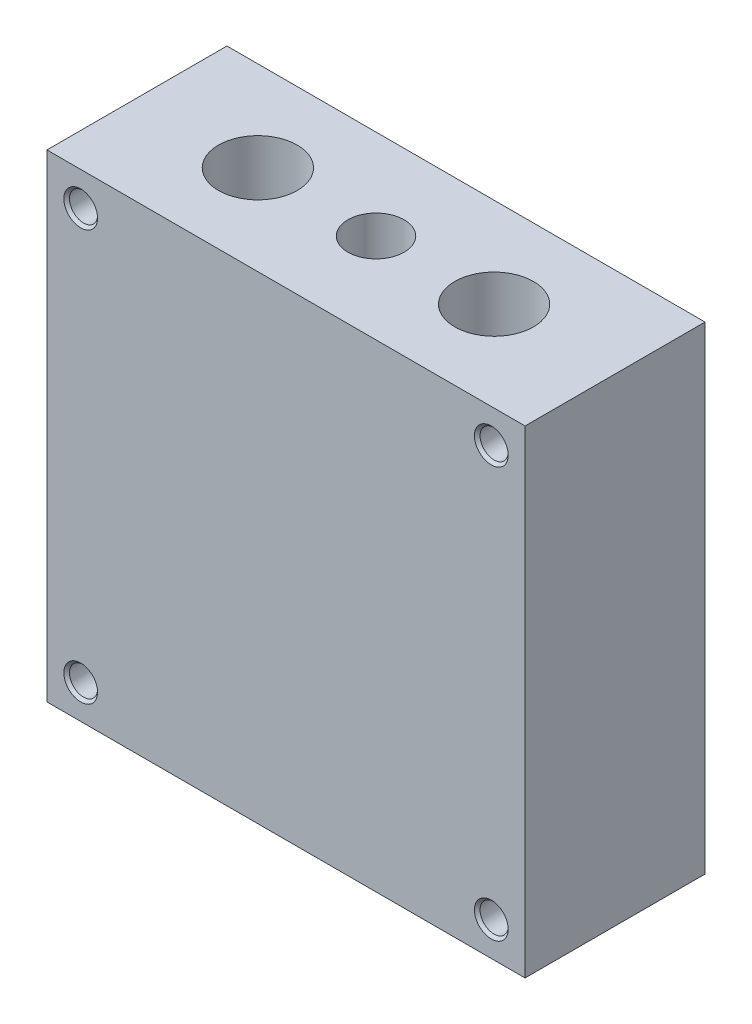
ISO-10303-21;
HEADER;
FILE_DESCRIPTION(('STEP AP214'),'2;1');
FILE_NAME('part.step','',(''),(''),'','','');
FILE_SCHEMA(('AUTOMOTIVE_DESIGN { 1 0 10303 214 1 1 1 1 }'));
ENDSEC;
DATA;
#1=APPLICATION_CONTEXT('core data for automotive mechanical design processes');
#2=APPLICATION_PROTOCOL_DEFINITION('international standard','automotive_design',2000,#1);
#3=PRODUCT_CONTEXT('',#1,'mechanical');
#4=PRODUCT('Part','Part','',(#3));
#5=PRODUCT_RELATED_PRODUCT_CATEGORY('part','',(#4));
#6=PRODUCT_DEFINITION_FORMATION('','',#4);
#7=PRODUCT_DEFINITION_CONTEXT('part definition',#1,'design');
#8=PRODUCT_DEFINITION('design','',#6,#7);
#9=PRODUCT_DEFINITION_SHAPE('','',#8);
#10=(LENGTH_UNIT() NAMED_UNIT(*) SI_UNIT(.MILLI.,.METRE.));
#11=(NAMED_UNIT(*) PLANE_ANGLE_UNIT() SI_UNIT($,.RADIAN.));
#12=(NAMED_UNIT(*) SI_UNIT($,.STERADIAN.) SOLID_ANGLE_UNIT());
#13=UNCERTAINTY_MEASURE_WITH_UNIT(LENGTH_MEASURE(1.E-05),#10,'distance_accuracy_value','');
#14=(GEOMETRIC_REPRESENTATION_CONTEXT(3) GLOBAL_UNCERTAINTY_ASSIGNED_CONTEXT((#13)) GLOBAL_UNIT_ASSIGNED_CONTEXT((#10,
#11,#12)) REPRESENTATION_CONTEXT('',''));
#15=CARTESIAN_POINT('',(0.,0.,0.));
#16=DIRECTION('',(0.,0.,1.));
#17=DIRECTION('',(1.,0.,0.));
#18=AXIS2_PLACEMENT_3D('',#15,#16,#17);
#19=CARTESIAN_POINT('',(21.,197.5,18.));
#20=DIRECTION('',(0.,-1.,0.));
#21=DIRECTION('',(0.,0.,-1.));
#22=AXIS2_PLACEMENT_3D('',#19,#20,#21);
#23=CYLINDRICAL_SURFACE('',#22,7.0001);
#24=CARTESIAN_POINT('',(21.,223.,18.));
#25=DIRECTION('',(0.,-1.,0.));
#26=DIRECTION('',(0.,0.,-1.));
#27=AXIS2_PLACEMENT_3D('',#24,#25,#26);
#28=CIRCLE('',#27,7.0001);
#29=CARTESIAN_POINT('',(21.,223.,10.9999));
#30=VERTEX_POINT('',#29);
#31=EDGE_CURVE('E23',#30,#30,#28,.F.);
#32=ORIENTED_EDGE('',*,*,#31,.T.);
#33=EDGE_LOOP('',(#32));
#34=FACE_BOUND('',#33,.T.);
#35=CARTESIAN_POINT('',(21.,172.,18.));
#36=DIRECTION('',(0.,-1.,0.));
#37=DIRECTION('',(0.,0.,-1.));
#38=AXIS2_PLACEMENT_3D('',#35,#36,#37);
#39=CIRCLE('',#38,7.0001);
#40=CARTESIAN_POINT('',(21.,172.,10.9999));
#41=VERTEX_POINT('',#40);
#42=EDGE_CURVE('E559',#41,#41,#39,.T.);
#43=ORIENTED_EDGE('',*,*,#42,.T.);
#44=EDGE_LOOP('',(#43));
#45=FACE_BOUND('',#44,.T.);
#46=ADVANCED_FACE('F19',(#34,#45),#23,.F.);
#47=CARTESIAN_POINT('',(-21.,197.5,18.));
#48=DIRECTION('',(0.,-1.,0.));
#49=DIRECTION('',(0.,0.,-1.));
#50=AXIS2_PLACEMENT_3D('',#47,#48,#49);
#51=CYLINDRICAL_SURFACE('',#50,7.0001);
#52=CARTESIAN_POINT('',(-21.,223.,18.));
#53=DIRECTION('',(0.,-1.,0.));
#54=DIRECTION('',(0.,0.,-1.));
#55=AXIS2_PLACEMENT_3D('',#52,#53,#54);
#56=CIRCLE('',#55,7.0001);
#57=CARTESIAN_POINT('',(-21.,223.,10.9999));
#58=VERTEX_POINT('',#57);
#59=EDGE_CURVE('E553',#58,#58,#56,.F.);
#60=ORIENTED_EDGE('',*,*,#59,.T.);
#61=EDGE_LOOP('',(#60));
#62=FACE_BOUND('',#61,.T.);
#63=CARTESIAN_POINT('',(-21.,172.,18.));
#64=DIRECTION('',(0.,-1.,0.));
#65=DIRECTION('',(0.,0.,-1.));
#66=AXIS2_PLACEMENT_3D('',#63,#64,#65);
#67=CIRCLE('',#66,7.0001);
#68=CARTESIAN_POINT('',(-21.,172.,10.9999));
#69=VERTEX_POINT('',#68);
#70=EDGE_CURVE('E556',#69,#69,#67,.T.);
#71=ORIENTED_EDGE('',*,*,#70,.T.);
#72=EDGE_LOOP('',(#71));
#73=FACE_BOUND('',#72,.T.);
#74=ADVANCED_FACE('F541',(#62,#73),#51,.F.);
#75=CARTESIAN_POINT('',(21.,223.,18.));
#76=DIRECTION('',(0.,-1.,0.));
#77=DIRECTION('',(0.,0.,-1.));
#78=AXIS2_PLACEMENT_3D('',#75,#76,#77);
#79=PLANE('',#78);
#80=CARTESIAN_POINT('',(21.,223.,18.));
#81=DIRECTION('',(0.,-1.,0.));
#82=DIRECTION('',(0.,0.,-1.));
#83=AXIS2_PLACEMENT_3D('',#80,#81,#82);
#84=CIRCLE('',#83,7.8);
#85=CARTESIAN_POINT('',(21.,223.,10.2));
#86=VERTEX_POINT('',#85);
#87=EDGE_CURVE('E246',#86,#86,#84,.F.);
#88=ORIENTED_EDGE('',*,*,#87,.T.);
#89=EDGE_LOOP('',(#88));
#90=FACE_BOUND('',#89,.T.);
#91=ORIENTED_EDGE('',*,*,#31,.F.);
#92=EDGE_LOOP('',(#91));
#93=FACE_BOUND('',#92,.T.);
#94=ADVANCED_FACE('F538',(#90,#93),#79,.F.);
#95=CARTESIAN_POINT('',(-21.,223.,18.));
#96=DIRECTION('',(0.,-1.,0.));
#97=DIRECTION('',(0.,0.,-1.));
#98=AXIS2_PLACEMENT_3D('',#95,#96,#97);
#99=PLANE('',#98);
#100=CARTESIAN_POINT('',(-21.,223.,18.));
#101=DIRECTION('',(0.,-1.,0.));
#102=DIRECTION('',(0.,0.,-1.));
#103=AXIS2_PLACEMENT_3D('',#100,#101,#102);
#104=CIRCLE('',#103,7.8);
#105=CARTESIAN_POINT('',(-21.,223.,10.2));
#106=VERTEX_POINT('',#105);
#107=EDGE_CURVE('E239',#106,#106,#104,.F.);
#108=ORIENTED_EDGE('',*,*,#107,.T.);
#109=EDGE_LOOP('',(#108));
#110=FACE_BOUND('',#109,.T.);
#111=ORIENTED_EDGE('',*,*,#59,.F.);
#112=EDGE_LOOP('',(#111));
#113=FACE_BOUND('',#112,.T.);
#114=ADVANCED_FACE('F532',(#110,#113),#99,.F.);
#115=CARTESIAN_POINT('',(21.,172.,18.));
#116=DIRECTION('',(0.,1.,0.));
#117=DIRECTION('',(0.,0.,1.));
#118=AXIS2_PLACEMENT_3D('',#115,#116,#117);
#119=PLANE('',#118);
#120=CARTESIAN_POINT('',(21.,172.,18.));
#121=DIRECTION('',(0.,-1.,0.));
#122=DIRECTION('',(0.,0.,-1.));
#123=AXIS2_PLACEMENT_3D('',#120,#121,#122);
#124=CIRCLE('',#123,7.8);
#125=CARTESIAN_POINT('',(21.,172.,10.2));
#126=VERTEX_POINT('',#125);
#127=EDGE_CURVE('E233',#126,#126,#124,.T.);
#128=ORIENTED_EDGE('',*,*,#127,.T.);
#129=EDGE_LOOP('',(#128));
#130=FACE_BOUND('',#129,.T.);
#131=ORIENTED_EDGE('',*,*,#42,.F.);
#132=EDGE_LOOP('',(#131));
#133=FACE_BOUND('',#132,.T.);
#134=ADVANCED_FACE('F528',(#130,#133),#119,.F.);
#135=CARTESIAN_POINT('',(-21.,172.,18.));
#136=DIRECTION('',(0.,1.,0.));
#137=DIRECTION('',(0.,0.,1.));
#138=AXIS2_PLACEMENT_3D('',#135,#136,#137);
#139=PLANE('',#138);
#140=CARTESIAN_POINT('',(-21.,172.,18.));
#141=DIRECTION('',(0.,-1.,0.));
#142=DIRECTION('',(0.,0.,-1.));
#143=AXIS2_PLACEMENT_3D('',#140,#141,#142);
#144=CIRCLE('',#143,7.8);
#145=CARTESIAN_POINT('',(-21.,172.,10.2));
#146=VERTEX_POINT('',#145);
#147=EDGE_CURVE('E226',#146,#146,#144,.T.);
#148=ORIENTED_EDGE('',*,*,#147,.T.);
#149=EDGE_LOOP('',(#148));
#150=FACE_BOUND('',#149,.T.);
#151=ORIENTED_EDGE('',*,*,#70,.F.);
#152=EDGE_LOOP('',(#151));
#153=FACE_BOUND('',#152,.T.);
#154=ADVANCED_FACE('F525',(#150,#153),#139,.F.);
#155=CARTESIAN_POINT('',(36.5,234.,13.));
#156=DIRECTION('',(0.,0.,1.));
#157=DIRECTION('',(1.,0.,0.));
#158=AXIS2_PLACEMENT_3D('',#155,#156,#157);
#159=CYLINDRICAL_SURFACE('',#158,3.15);
#160=CARTESIAN_POINT('',(36.5,234.,8.));
#161=DIRECTION('',(0.,0.,1.));
#162=DIRECTION('',(1.,0.,0.));
#163=AXIS2_PLACEMENT_3D('',#160,#161,#162);
#164=CIRCLE('',#163,3.15);
#165=CARTESIAN_POINT('',(39.65,234.,8.));
#166=VERTEX_POINT('',#165);
#167=EDGE_CURVE('E232',#166,#166,#164,.F.);
#168=ORIENTED_EDGE('',*,*,#167,.T.);
#169=EDGE_LOOP('',(#168));
#170=FACE_BOUND('',#169,.T.);
#171=CARTESIAN_POINT('',(36.5,234.,18.));
#172=DIRECTION('',(0.,0.,1.));
#173=DIRECTION('',(1.,0.,0.));
#174=AXIS2_PLACEMENT_3D('',#171,#172,#173);
#175=CIRCLE('',#174,3.15);
#176=CARTESIAN_POINT('',(39.65,234.,18.));
#177=VERTEX_POINT('',#176);
#178=EDGE_CURVE('E256',#177,#177,#175,.T.);
#179=ORIENTED_EDGE('',*,*,#178,.T.);
#180=EDGE_LOOP('',(#179));
#181=FACE_BOUND('',#180,.T.);
#182=ADVANCED_FACE('F307',(#170,#181),#159,.F.);
#183=CARTESIAN_POINT('',(36.5,161.,13.));
#184=DIRECTION('',(0.,0.,1.));
#185=DIRECTION('',(1.,0.,0.));
#186=AXIS2_PLACEMENT_3D('',#183,#184,#185);
#187=CYLINDRICAL_SURFACE('',#186,3.15);
#188=CARTESIAN_POINT('',(36.5,161.,8.));
#189=DIRECTION('',(0.,0.,1.));
#190=DIRECTION('',(1.,0.,0.));
#191=AXIS2_PLACEMENT_3D('',#188,#189,#190);
#192=CIRCLE('',#191,3.15);
#193=CARTESIAN_POINT('',(39.65,161.,8.));
#194=VERTEX_POINT('',#193);
#195=EDGE_CURVE('E298',#194,#194,#192,.F.);
#196=ORIENTED_EDGE('',*,*,#195,.T.);
#197=EDGE_LOOP('',(#196));
#198=FACE_BOUND('',#197,.T.);
#199=CARTESIAN_POINT('',(36.5,161.,18.));
#200=DIRECTION('',(0.,0.,1.));
#201=DIRECTION('',(1.,0.,0.));
#202=AXIS2_PLACEMENT_3D('',#199,#200,#201);
#203=CIRCLE('',#202,3.15);
#204=CARTESIAN_POINT('',(39.65,161.,18.));
#205=VERTEX_POINT('',#204);
#206=EDGE_CURVE('E252',#205,#205,#203,.T.);
#207=ORIENTED_EDGE('',*,*,#206,.T.);
#208=EDGE_LOOP('',(#207));
#209=FACE_BOUND('',#208,.T.);
#210=ADVANCED_FACE('F516',(#198,#209),#187,.F.);
#211=CARTESIAN_POINT('',(-36.5,234.,13.));
#212=DIRECTION('',(0.,0.,1.));
#213=DIRECTION('',(1.,0.,0.));
#214=AXIS2_PLACEMENT_3D('',#211,#212,#213);
#215=CYLINDRICAL_SURFACE('',#214,3.15);
#216=CARTESIAN_POINT('',(-36.5,234.,8.));
#217=DIRECTION('',(0.,0.,1.));
#218=DIRECTION('',(1.,0.,0.));
#219=AXIS2_PLACEMENT_3D('',#216,#217,#218);
#220=CIRCLE('',#219,3.15);
#221=CARTESIAN_POINT('',(-33.35,234.,8.));
#222=VERTEX_POINT('',#221);
#223=EDGE_CURVE('E295',#222,#222,#220,.F.);
#224=ORIENTED_EDGE('',*,*,#223,.T.);
#225=EDGE_LOOP('',(#224));
#226=FACE_BOUND('',#225,.T.);
#227=CARTESIAN_POINT('',(-36.5,234.,18.));
#228=DIRECTION('',(0.,0.,1.));
#229=DIRECTION('',(1.,0.,0.));
#230=AXIS2_PLACEMENT_3D('',#227,#228,#229);
#231=CIRCLE('',#230,3.15);
#232=CARTESIAN_POINT('',(-33.35,234.,18.));
#233=VERTEX_POINT('',#232);
#234=EDGE_CURVE('E247',#233,#233,#231,.T.);
#235=ORIENTED_EDGE('',*,*,#234,.T.);
#236=EDGE_LOOP('',(#235));
#237=FACE_BOUND('',#236,.T.);
#238=ADVANCED_FACE('F511',(#226,#237),#215,.F.);
#239=CARTESIAN_POINT('',(-36.5,161.,13.));
#240=DIRECTION('',(0.,0.,1.));
#241=DIRECTION('',(1.,0.,0.));
#242=AXIS2_PLACEMENT_3D('',#239,#240,#241);
#243=CYLINDRICAL_SURFACE('',#242,3.15);
#244=CARTESIAN_POINT('',(-36.5,161.,8.));
#245=DIRECTION('',(0.,0.,1.));
#246=DIRECTION('',(1.,0.,0.));
#247=AXIS2_PLACEMENT_3D('',#244,#245,#246);
#248=CIRCLE('',#247,3.15);
#249=CARTESIAN_POINT('',(-33.35,161.,8.));
#250=VERTEX_POINT('',#249);
#251=EDGE_CURVE('E291',#250,#250,#248,.F.);
#252=ORIENTED_EDGE('',*,*,#251,.T.);
#253=EDGE_LOOP('',(#252));
#254=FACE_BOUND('',#253,.T.);
#255=CARTESIAN_POINT('',(-36.5,161.,18.));
#256=DIRECTION('',(0.,0.,1.));
#257=DIRECTION('',(1.,0.,0.));
#258=AXIS2_PLACEMENT_3D('',#255,#256,#257);
#259=CIRCLE('',#258,3.15);
#260=CARTESIAN_POINT('',(-33.35,161.,18.));
#261=VERTEX_POINT('',#260);
#262=EDGE_CURVE('E242',#261,#261,#259,.T.);
#263=ORIENTED_EDGE('',*,*,#262,.T.);
#264=EDGE_LOOP('',(#263));
#265=FACE_BOUND('',#264,.T.);
#266=ADVANCED_FACE('F515',(#254,#265),#243,.F.);
#267=CARTESIAN_POINT('',(38.075,234.,18.));
#268=DIRECTION('',(0.,0.,1.));
#269=DIRECTION('',(1.,0.,0.));
#270=AXIS2_PLACEMENT_3D('',#267,#268,#269);
#271=PLANE('',#270);
#272=ORIENTED_EDGE('',*,*,#178,.F.);
#273=EDGE_LOOP('',(#272));
#274=FACE_BOUND('',#273,.T.);
#275=CARTESIAN_POINT('',(36.5,234.,18.0000000000291));
#276=DIRECTION('',(0.,0.,-1.));
#277=DIRECTION('',(-1.,0.,0.));
#278=AXIS2_PLACEMENT_3D('',#275,#276,#277);
#279=CIRCLE('',#278,2.99999999999636);
#280=CARTESIAN_POINT('',(33.5000000000036,234.,18.0000000000291));
#281=VERTEX_POINT('',#280);
#282=EDGE_CURVE('E287',#281,#281,#279,.F.);
#283=ORIENTED_EDGE('',*,*,#282,.T.);
#284=EDGE_LOOP('',(#283));
#285=FACE_BOUND('',#284,.T.);
#286=ADVANCED_FACE('F614',(#274,#285),#271,.F.);
#287=CARTESIAN_POINT('',(38.075,161.,18.));
#288=DIRECTION('',(0.,0.,1.));
#289=DIRECTION('',(1.,0.,0.));
#290=AXIS2_PLACEMENT_3D('',#287,#288,#289);
#291=PLANE('',#290);
#292=ORIENTED_EDGE('',*,*,#206,.F.);
#293=EDGE_LOOP('',(#292));
#294=FACE_BOUND('',#293,.T.);
#295=CARTESIAN_POINT('',(36.5,161.,18.0000000000291));
#296=DIRECTION('',(0.,0.,-1.));
#297=DIRECTION('',(-1.,0.,0.));
#298=AXIS2_PLACEMENT_3D('',#295,#296,#297);
#299=CIRCLE('',#298,2.99999999999636);
#300=CARTESIAN_POINT('',(33.5000000000036,161.,18.0000000000291));
#301=VERTEX_POINT('',#300);
#302=EDGE_CURVE('E283',#301,#301,#299,.F.);
#303=ORIENTED_EDGE('',*,*,#302,.T.);
#304=EDGE_LOOP('',(#303));
#305=FACE_BOUND('',#304,.T.);
#306=ADVANCED_FACE('F611',(#294,#305),#291,.F.);
#307=CARTESIAN_POINT('',(-34.925,234.,18.));
#308=DIRECTION('',(0.,0.,1.));
#309=DIRECTION('',(1.,0.,0.));
#310=AXIS2_PLACEMENT_3D('',#307,#308,#309);
#311=PLANE('',#310);
#312=ORIENTED_EDGE('',*,*,#234,.F.);
#313=EDGE_LOOP('',(#312));
#314=FACE_BOUND('',#313,.T.);
#315=CARTESIAN_POINT('',(-36.5,234.,18.0000000000291));
#316=DIRECTION('',(0.,0.,-1.));
#317=DIRECTION('',(-1.,0.,0.));
#318=AXIS2_PLACEMENT_3D('',#315,#316,#317);
#319=CIRCLE('',#318,2.99999999997545);
#320=CARTESIAN_POINT('',(-39.4999999999754,234.,18.0000000000291));
#321=VERTEX_POINT('',#320);
#322=EDGE_CURVE('E279',#321,#321,#319,.F.);
#323=ORIENTED_EDGE('',*,*,#322,.T.);
#324=EDGE_LOOP('',(#323));
#325=FACE_BOUND('',#324,.T.);
#326=ADVANCED_FACE('F607',(#314,#325),#311,.F.);
#327=CARTESIAN_POINT('',(-34.925,161.,18.));
#328=DIRECTION('',(0.,0.,1.));
#329=DIRECTION('',(1.,0.,0.));
#330=AXIS2_PLACEMENT_3D('',#327,#328,#329);
#331=PLANE('',#330);
#332=ORIENTED_EDGE('',*,*,#262,.F.);
#333=EDGE_LOOP('',(#332));
#334=FACE_BOUND('',#333,.T.);
#335=CARTESIAN_POINT('',(-36.5,161.,18.0000000000291));
#336=DIRECTION('',(0.,0.,-1.));
#337=DIRECTION('',(-1.,0.,0.));
#338=AXIS2_PLACEMENT_3D('',#335,#336,#337);
#339=CIRCLE('',#338,2.99999999997545);
#340=CARTESIAN_POINT('',(-39.4999999999754,161.,18.0000000000291));
#341=VERTEX_POINT('',#340);
#342=EDGE_CURVE('E275',#341,#341,#339,.F.);
#343=ORIENTED_EDGE('',*,*,#342,.T.);
#344=EDGE_LOOP('',(#343));
#345=FACE_BOUND('',#344,.T.);
#346=ADVANCED_FACE('F597',(#334,#345),#331,.F.);
#347=CARTESIAN_POINT('',(21.,224.5,18.));
#348=DIRECTION('',(0.,-1.,0.));
#349=DIRECTION('',(0.,0.,-1.));
#350=AXIS2_PLACEMENT_3D('',#347,#348,#349);
#351=CYLINDRICAL_SURFACE('',#350,7.8);
#352=CARTESIAN_POINT('',(21.,226.,18.));
#353=DIRECTION('',(0.,-1.,0.));
#354=DIRECTION('',(0.,0.,-1.));
#355=AXIS2_PLACEMENT_3D('',#352,#353,#354);
#356=CIRCLE('',#355,7.8);
#357=CARTESIAN_POINT('',(21.,226.,10.2));
#358=VERTEX_POINT('',#357);
#359=EDGE_CURVE('E271',#358,#358,#356,.F.);
#360=ORIENTED_EDGE('',*,*,#359,.T.);
#361=EDGE_LOOP('',(#360));
#362=FACE_BOUND('',#361,.T.);
#363=ORIENTED_EDGE('',*,*,#87,.F.);
#364=EDGE_LOOP('',(#363));
#365=FACE_BOUND('',#364,.T.);
#366=ADVANCED_FACE('F588',(#362,#365),#351,.F.);
#367=CARTESIAN_POINT('',(-21.,224.5,18.));
#368=DIRECTION('',(0.,-1.,0.));
#369=DIRECTION('',(0.,0.,-1.));
#370=AXIS2_PLACEMENT_3D('',#367,#368,#369);
#371=CYLINDRICAL_SURFACE('',#370,7.8);
#372=CARTESIAN_POINT('',(-21.,226.,18.));
#373=DIRECTION('',(0.,-1.,0.));
#374=DIRECTION('',(0.,0.,-1.));
#375=AXIS2_PLACEMENT_3D('',#372,#373,#374);
#376=CIRCLE('',#375,7.8);
#377=CARTESIAN_POINT('',(-21.,226.,10.2));
#378=VERTEX_POINT('',#377);
#379=EDGE_CURVE('E265',#378,#378,#376,.F.);
#380=ORIENTED_EDGE('',*,*,#379,.T.);
#381=EDGE_LOOP('',(#380));
#382=FACE_BOUND('',#381,.T.);
#383=ORIENTED_EDGE('',*,*,#107,.F.);
#384=EDGE_LOOP('',(#383));
#385=FACE_BOUND('',#384,.T.);
#386=ADVANCED_FACE('F585',(#382,#385),#371,.F.);
#387=CARTESIAN_POINT('',(21.,170.5,18.));
#388=DIRECTION('',(0.,-1.,0.));
#389=DIRECTION('',(0.,0.,-1.));
#390=AXIS2_PLACEMENT_3D('',#387,#388,#389);
#391=CYLINDRICAL_SURFACE('',#390,7.8);
#392=CARTESIAN_POINT('',(21.,169.,18.));
#393=DIRECTION('',(0.,-1.,0.));
#394=DIRECTION('',(0.,0.,-1.));
#395=AXIS2_PLACEMENT_3D('',#392,#393,#394);
#396=CIRCLE('',#395,7.8);
#397=CARTESIAN_POINT('',(21.,169.,10.2));
#398=VERTEX_POINT('',#397);
#399=EDGE_CURVE('E259',#398,#398,#396,.T.);
#400=ORIENTED_EDGE('',*,*,#399,.T.);
#401=EDGE_LOOP('',(#400));
#402=FACE_BOUND('',#401,.T.);
#403=ORIENTED_EDGE('',*,*,#127,.F.);
#404=EDGE_LOOP('',(#403));
#405=FACE_BOUND('',#404,.T.);
#406=ADVANCED_FACE('F587',(#402,#405),#391,.F.);
#407=CARTESIAN_POINT('',(-21.,170.5,18.));
#408=DIRECTION('',(0.,-1.,0.));
#409=DIRECTION('',(0.,0.,-1.));
#410=AXIS2_PLACEMENT_3D('',#407,#408,#409);
#411=CYLINDRICAL_SURFACE('',#410,7.8);
#412=CARTESIAN_POINT('',(-21.,169.,18.));
#413=DIRECTION('',(0.,-1.,0.));
#414=DIRECTION('',(0.,0.,-1.));
#415=AXIS2_PLACEMENT_3D('',#412,#413,#414);
#416=CIRCLE('',#415,7.8);
#417=CARTESIAN_POINT('',(-21.,169.,10.2));
#418=VERTEX_POINT('',#417);
#419=EDGE_CURVE('E264',#418,#418,#416,.T.);
#420=ORIENTED_EDGE('',*,*,#419,.T.);
#421=EDGE_LOOP('',(#420));
#422=FACE_BOUND('',#421,.T.);
#423=ORIENTED_EDGE('',*,*,#147,.F.);
#424=EDGE_LOOP('',(#423));
#425=FACE_BOUND('',#424,.T.);
#426=ADVANCED_FACE('F314',(#422,#425),#411,.F.);
#427=CARTESIAN_POINT('',(40.575,234.,8.));
#428=DIRECTION('',(0.,0.,1.));
#429=DIRECTION('',(1.,0.,0.));
#430=AXIS2_PLACEMENT_3D('',#427,#428,#429);
#431=PLANE('',#430);
#432=ORIENTED_EDGE('',*,*,#167,.F.);
#433=EDGE_LOOP('',(#432));
#434=FACE_BOUND('',#433,.T.);
#435=CARTESIAN_POINT('',(36.5,234.,8.));
#436=DIRECTION('',(0.,0.,1.));
#437=DIRECTION('',(1.,0.,0.));
#438=AXIS2_PLACEMENT_3D('',#435,#436,#437);
#439=CIRCLE('',#438,5.);
#440=CARTESIAN_POINT('',(41.5,234.,8.));
#441=VERTEX_POINT('',#440);
#442=EDGE_CURVE('E318',#441,#441,#439,.F.);
#443=ORIENTED_EDGE('',*,*,#442,.T.);
#444=EDGE_LOOP('',(#443));
#445=FACE_BOUND('',#444,.T.);
#446=ADVANCED_FACE('F310',(#434,#445),#431,.F.);
#447=CARTESIAN_POINT('',(40.575,161.,8.));
#448=DIRECTION('',(0.,0.,1.));
#449=DIRECTION('',(1.,0.,0.));
#450=AXIS2_PLACEMENT_3D('',#447,#448,#449);
#451=PLANE('',#450);
#452=ORIENTED_EDGE('',*,*,#195,.F.);
#453=EDGE_LOOP('',(#452));
#454=FACE_BOUND('',#453,.T.);
#455=CARTESIAN_POINT('',(36.5,161.,8.));
#456=DIRECTION('',(0.,0.,1.));
#457=DIRECTION('',(1.,0.,0.));
#458=AXIS2_PLACEMENT_3D('',#455,#456,#457);
#459=CIRCLE('',#458,5.);
#460=CARTESIAN_POINT('',(41.5,161.,8.));
#461=VERTEX_POINT('',#460);
#462=EDGE_CURVE('E321',#461,#461,#459,.F.);
#463=ORIENTED_EDGE('',*,*,#462,.T.);
#464=EDGE_LOOP('',(#463));
#465=FACE_BOUND('',#464,.T.);
#466=ADVANCED_FACE('F313',(#454,#465),#451,.F.);
#467=CARTESIAN_POINT('',(-32.425,234.,8.));
#468=DIRECTION('',(0.,0.,1.));
#469=DIRECTION('',(1.,0.,0.));
#470=AXIS2_PLACEMENT_3D('',#467,#468,#469);
#471=PLANE('',#470);
#472=ORIENTED_EDGE('',*,*,#223,.F.);
#473=EDGE_LOOP('',(#472));
#474=FACE_BOUND('',#473,.T.);
#475=CARTESIAN_POINT('',(-36.5,234.,8.));
#476=DIRECTION('',(0.,0.,1.));
#477=DIRECTION('',(1.,0.,0.));
#478=AXIS2_PLACEMENT_3D('',#475,#476,#477);
#479=CIRCLE('',#478,5.);
#480=CARTESIAN_POINT('',(-31.5,234.,8.));
#481=VERTEX_POINT('',#480);
#482=EDGE_CURVE('E324',#481,#481,#479,.F.);
#483=ORIENTED_EDGE('',*,*,#482,.T.);
#484=EDGE_LOOP('',(#483));
#485=FACE_BOUND('',#484,.T.);
#486=ADVANCED_FACE('F645',(#474,#485),#471,.F.);
#487=CARTESIAN_POINT('',(-32.425,161.,8.));
#488=DIRECTION('',(0.,0.,1.));
#489=DIRECTION('',(1.,0.,0.));
#490=AXIS2_PLACEMENT_3D('',#487,#488,#489);
#491=PLANE('',#490);
#492=ORIENTED_EDGE('',*,*,#251,.F.);
#493=EDGE_LOOP('',(#492));
#494=FACE_BOUND('',#493,.T.);
#495=CARTESIAN_POINT('',(-36.5,161.,8.));
#496=DIRECTION('',(0.,0.,1.));
#497=DIRECTION('',(1.,0.,0.));
#498=AXIS2_PLACEMENT_3D('',#495,#496,#497);
#499=CIRCLE('',#498,5.);
#500=CARTESIAN_POINT('',(-31.5,161.,8.));
#501=VERTEX_POINT('',#500);
#502=EDGE_CURVE('E199',#501,#501,#499,.F.);
#503=ORIENTED_EDGE('',*,*,#502,.T.);
#504=EDGE_LOOP('',(#503));
#505=FACE_BOUND('',#504,.T.);
#506=ADVANCED_FACE('F630',(#494,#505),#491,.F.);
#507=CARTESIAN_POINT('',(36.5,234.,18.0000000001428));
#508=DIRECTION('',(0.,0.,-1.));
#509=DIRECTION('',(-1.,0.,0.));
#510=AXIS2_PLACEMENT_3D('',#507,#508,#509);
#511=CONICAL_SURFACE('',#510,2.99999999988267,0.785398163397448);
#512=ORIENTED_EDGE('',*,*,#282,.F.);
#513=EDGE_LOOP('',(#512));
#514=FACE_BOUND('',#513,.T.);
#515=CARTESIAN_POINT('',(36.5,234.,18.5));
#516=DIRECTION('',(0.,0.,-1.));
#517=DIRECTION('',(-1.,0.,0.));
#518=AXIS2_PLACEMENT_3D('',#515,#516,#517);
#519=CIRCLE('',#518,2.5);
#520=CARTESIAN_POINT('',(34.,234.,18.5));
#521=VERTEX_POINT('',#520);
#522=EDGE_CURVE('E195',#521,#521,#519,.F.);
#523=ORIENTED_EDGE('',*,*,#522,.T.);
#524=EDGE_LOOP('',(#523));
#525=FACE_BOUND('',#524,.T.);
#526=ADVANCED_FACE('F626',(#514,#525),#511,.F.);
#527=CARTESIAN_POINT('',(36.5,161.,18.0000000001428));
#528=DIRECTION('',(0.,0.,-1.));
#529=DIRECTION('',(-1.,0.,0.));
#530=AXIS2_PLACEMENT_3D('',#527,#528,#529);
#531=CONICAL_SURFACE('',#530,2.99999999988267,0.785398163397448);
#532=ORIENTED_EDGE('',*,*,#302,.F.);
#533=EDGE_LOOP('',(#532));
#534=FACE_BOUND('',#533,.T.);
#535=CARTESIAN_POINT('',(36.5,161.,18.5));
#536=DIRECTION('',(0.,0.,-1.));
#537=DIRECTION('',(-1.,0.,0.));
#538=AXIS2_PLACEMENT_3D('',#535,#536,#537);
#539=CIRCLE('',#538,2.5);
#540=CARTESIAN_POINT('',(34.,161.,18.5));
#541=VERTEX_POINT('',#540);
#542=EDGE_CURVE('E191',#541,#541,#539,.F.);
#543=ORIENTED_EDGE('',*,*,#542,.T.);
#544=EDGE_LOOP('',(#543));
#545=FACE_BOUND('',#544,.T.);
#546=ADVANCED_FACE('F629',(#534,#545),#531,.F.);
#547=CARTESIAN_POINT('',(-36.5,234.,18.0000000001428));
#548=DIRECTION('',(0.,0.,-1.));
#549=DIRECTION('',(-1.,0.,0.));
#550=AXIS2_PLACEMENT_3D('',#547,#548,#549);
#551=CONICAL_SURFACE('',#550,2.99999999986176,0.785398163397448);
#552=ORIENTED_EDGE('',*,*,#322,.F.);
#553=EDGE_LOOP('',(#552));
#554=FACE_BOUND('',#553,.T.);
#555=CARTESIAN_POINT('',(-36.5,234.,18.5));
#556=DIRECTION('',(0.,0.,-1.));
#557=DIRECTION('',(-1.,0.,0.));
#558=AXIS2_PLACEMENT_3D('',#555,#556,#557);
#559=CIRCLE('',#558,2.5);
#560=CARTESIAN_POINT('',(-39.,234.,18.5));
#561=VERTEX_POINT('',#560);
#562=EDGE_CURVE('E187',#561,#561,#559,.F.);
#563=ORIENTED_EDGE('',*,*,#562,.T.);
#564=EDGE_LOOP('',(#563));
#565=FACE_BOUND('',#564,.T.);
#566=ADVANCED_FACE('F642',(#554,#565),#551,.F.);
#567=CARTESIAN_POINT('',(-36.5,161.,18.0000000001428));
#568=DIRECTION('',(0.,0.,-1.));
#569=DIRECTION('',(-1.,0.,0.));
#570=AXIS2_PLACEMENT_3D('',#567,#568,#569);
#571=CONICAL_SURFACE('',#570,2.99999999986176,0.785398163397448);
#572=ORIENTED_EDGE('',*,*,#342,.F.);
#573=EDGE_LOOP('',(#572));
#574=FACE_BOUND('',#573,.T.);
#575=CARTESIAN_POINT('',(-36.5,161.,18.5));
#576=DIRECTION('',(0.,0.,-1.));
#577=DIRECTION('',(-1.,0.,0.));
#578=AXIS2_PLACEMENT_3D('',#575,#576,#577);
#579=CIRCLE('',#578,2.5);
#580=CARTESIAN_POINT('',(-39.,161.,18.5));
#581=VERTEX_POINT('',#580);
#582=EDGE_CURVE('E182',#581,#581,#579,.F.);
#583=ORIENTED_EDGE('',*,*,#582,.T.);
#584=EDGE_LOOP('',(#583));
#585=FACE_BOUND('',#584,.T.);
#586=ADVANCED_FACE('F709',(#574,#585),#571,.F.);
#587=CARTESIAN_POINT('',(21.,226.,18.));
#588=DIRECTION('',(0.,1.,0.));
#589=DIRECTION('',(0.,0.,1.));
#590=AXIS2_PLACEMENT_3D('',#587,#588,#589);
#591=PLANE('',#590);
#592=ORIENTED_EDGE('',*,*,#359,.F.);
#593=EDGE_LOOP('',(#592));
#594=FACE_BOUND('',#593,.T.);
#595=CARTESIAN_POINT('',(21.,226.,18.));
#596=DIRECTION('',(0.,-1.,0.));
#597=DIRECTION('',(0.,0.,-1.));
#598=AXIS2_PLACEMENT_3D('',#595,#596,#597);
#599=CIRCLE('',#598,7.0001);
#600=CARTESIAN_POINT('',(21.,226.,10.9999));
#601=VERTEX_POINT('',#600);
#602=EDGE_CURVE('E186',#601,#601,#599,.F.);
#603=ORIENTED_EDGE('',*,*,#602,.T.);
#604=EDGE_LOOP('',(#603));
#605=FACE_BOUND('',#604,.T.);
#606=ADVANCED_FACE('F717',(#594,#605),#591,.F.);
#607=CARTESIAN_POINT('',(-21.,226.,18.));
#608=DIRECTION('',(0.,1.,0.));
#609=DIRECTION('',(0.,0.,1.));
#610=AXIS2_PLACEMENT_3D('',#607,#608,#609);
#611=PLANE('',#610);
#612=ORIENTED_EDGE('',*,*,#379,.F.);
#613=EDGE_LOOP('',(#612));
#614=FACE_BOUND('',#613,.T.);
#615=CARTESIAN_POINT('',(-21.,226.,18.));
#616=DIRECTION('',(0.,-1.,0.));
#617=DIRECTION('',(0.,0.,-1.));
#618=AXIS2_PLACEMENT_3D('',#615,#616,#617);
#619=CIRCLE('',#618,7.0001);
#620=CARTESIAN_POINT('',(-21.,226.,10.9999));
#621=VERTEX_POINT('',#620);
#622=EDGE_CURVE('E338',#621,#621,#619,.F.);
#623=ORIENTED_EDGE('',*,*,#622,.T.);
#624=EDGE_LOOP('',(#623));
#625=FACE_BOUND('',#624,.T.);
#626=ADVANCED_FACE('F726',(#614,#625),#611,.F.);
#627=CARTESIAN_POINT('',(21.,169.,18.));
#628=DIRECTION('',(0.,-1.,0.));
#629=DIRECTION('',(0.,0.,-1.));
#630=AXIS2_PLACEMENT_3D('',#627,#628,#629);
#631=PLANE('',#630);
#632=ORIENTED_EDGE('',*,*,#399,.F.);
#633=EDGE_LOOP('',(#632));
#634=FACE_BOUND('',#633,.T.);
#635=CARTESIAN_POINT('',(21.,169.,18.));
#636=DIRECTION('',(0.,-1.,0.));
#637=DIRECTION('',(0.,0.,-1.));
#638=AXIS2_PLACEMENT_3D('',#635,#636,#637);
#639=CIRCLE('',#638,7.0001);
#640=CARTESIAN_POINT('',(21.,169.,10.9999));
#641=VERTEX_POINT('',#640);
#642=EDGE_CURVE('E341',#641,#641,#639,.T.);
#643=ORIENTED_EDGE('',*,*,#642,.T.);
#644=EDGE_LOOP('',(#643));
#645=FACE_BOUND('',#644,.T.);
#646=ADVANCED_FACE('F390',(#634,#645),#631,.F.);
#647=CARTESIAN_POINT('',(-21.,169.,18.));
#648=DIRECTION('',(0.,-1.,0.));
#649=DIRECTION('',(0.,0.,-1.));
#650=AXIS2_PLACEMENT_3D('',#647,#648,#649);
#651=PLANE('',#650);
#652=ORIENTED_EDGE('',*,*,#419,.F.);
#653=EDGE_LOOP('',(#652));
#654=FACE_BOUND('',#653,.T.);
#655=CARTESIAN_POINT('',(-21.,169.,18.));
#656=DIRECTION('',(0.,-1.,0.));
#657=DIRECTION('',(0.,0.,-1.));
#658=AXIS2_PLACEMENT_3D('',#655,#656,#657);
#659=CIRCLE('',#658,7.0001);
#660=CARTESIAN_POINT('',(-21.,169.,10.9999));
#661=VERTEX_POINT('',#660);
#662=EDGE_CURVE('E345',#661,#661,#659,.T.);
#663=ORIENTED_EDGE('',*,*,#662,.T.);
#664=EDGE_LOOP('',(#663));
#665=FACE_BOUND('',#664,.T.);
#666=ADVANCED_FACE('F380',(#654,#665),#651,.F.);
#667=CARTESIAN_POINT('',(36.5,234.,5.));
#668=DIRECTION('',(0.,0.,1.));
#669=DIRECTION('',(1.,0.,0.));
#670=AXIS2_PLACEMENT_3D('',#667,#668,#669);
#671=CYLINDRICAL_SURFACE('',#670,5.);
#672=ORIENTED_EDGE('',*,*,#442,.F.);
#673=EDGE_LOOP('',(#672));
#674=FACE_BOUND('',#673,.T.);
#675=CARTESIAN_POINT('',(36.5,234.,2.));
#676=DIRECTION('',(0.,0.,1.));
#677=DIRECTION('',(1.,0.,0.));
#678=AXIS2_PLACEMENT_3D('',#675,#676,#677);
#679=CIRCLE('',#678,5.);
#680=CARTESIAN_POINT('',(41.5,234.,2.));
#681=VERTEX_POINT('',#680);
#682=EDGE_CURVE('E350',#681,#681,#679,.F.);
#683=ORIENTED_EDGE('',*,*,#682,.T.);
#684=EDGE_LOOP('',(#683));
#685=FACE_BOUND('',#684,.T.);
#686=ADVANCED_FACE('F377',(#674,#685),#671,.F.);
#687=CARTESIAN_POINT('',(36.5,161.,5.));
#688=DIRECTION('',(0.,0.,1.));
#689=DIRECTION('',(1.,0.,0.));
#690=AXIS2_PLACEMENT_3D('',#687,#688,#689);
#691=CYLINDRICAL_SURFACE('',#690,5.);
#692=ORIENTED_EDGE('',*,*,#462,.F.);
#693=EDGE_LOOP('',(#692));
#694=FACE_BOUND('',#693,.T.);
#695=CARTESIAN_POINT('',(36.5,161.,2.));
#696=DIRECTION('',(0.,0.,1.));
#697=DIRECTION('',(1.,0.,0.));
#698=AXIS2_PLACEMENT_3D('',#695,#696,#697);
#699=CIRCLE('',#698,5.);
#700=CARTESIAN_POINT('',(41.5,161.,2.));
#701=VERTEX_POINT('',#700);
#702=EDGE_CURVE('E354',#701,#701,#699,.F.);
#703=ORIENTED_EDGE('',*,*,#702,.T.);
#704=EDGE_LOOP('',(#703));
#705=FACE_BOUND('',#704,.T.);
#706=ADVANCED_FACE('F379',(#694,#705),#691,.F.);
#707=CARTESIAN_POINT('',(-36.5,234.,5.));
#708=DIRECTION('',(0.,0.,1.));
#709=DIRECTION('',(1.,0.,0.));
#710=AXIS2_PLACEMENT_3D('',#707,#708,#709);
#711=CYLINDRICAL_SURFACE('',#710,5.);
#712=ORIENTED_EDGE('',*,*,#482,.F.);
#713=EDGE_LOOP('',(#712));
#714=FACE_BOUND('',#713,.T.);
#715=CARTESIAN_POINT('',(-36.5,234.,2.));
#716=DIRECTION('',(0.,0.,1.));
#717=DIRECTION('',(1.,0.,0.));
#718=AXIS2_PLACEMENT_3D('',#715,#716,#717);
#719=CIRCLE('',#718,5.);
#720=CARTESIAN_POINT('',(-31.5,234.,2.));
#721=VERTEX_POINT('',#720);
#722=EDGE_CURVE('E357',#721,#721,#719,.F.);
#723=ORIENTED_EDGE('',*,*,#722,.T.);
#724=EDGE_LOOP('',(#723));
#725=FACE_BOUND('',#724,.T.);
#726=ADVANCED_FACE('F387',(#714,#725),#711,.F.);
#727=CARTESIAN_POINT('',(-36.5,161.,5.));
#728=DIRECTION('',(0.,0.,1.));
#729=DIRECTION('',(1.,0.,0.));
#730=AXIS2_PLACEMENT_3D('',#727,#728,#729);
#731=CYLINDRICAL_SURFACE('',#730,5.);
#732=ORIENTED_EDGE('',*,*,#502,.F.);
#733=EDGE_LOOP('',(#732));
#734=FACE_BOUND('',#733,.T.);
#735=CARTESIAN_POINT('',(-36.5,161.,2.));
#736=DIRECTION('',(0.,0.,1.));
#737=DIRECTION('',(1.,0.,0.));
#738=AXIS2_PLACEMENT_3D('',#735,#736,#737);
#739=CIRCLE('',#738,5.);
#740=CARTESIAN_POINT('',(-31.5,161.,2.));
#741=VERTEX_POINT('',#740);
#742=EDGE_CURVE('E164',#741,#741,#739,.F.);
#743=ORIENTED_EDGE('',*,*,#742,.T.);
#744=EDGE_LOOP('',(#743));
#745=FACE_BOUND('',#744,.T.);
#746=ADVANCED_FACE('F366',(#734,#745),#731,.F.);
#747=CARTESIAN_POINT('',(36.5,234.,26.));
#748=DIRECTION('',(0.,0.,-1.));
#749=DIRECTION('',(-1.,0.,0.));
#750=AXIS2_PLACEMENT_3D('',#747,#748,#749);
#751=CYLINDRICAL_SURFACE('',#750,2.5);
#752=ORIENTED_EDGE('',*,*,#522,.F.);
#753=EDGE_LOOP('',(#752));
#754=FACE_BOUND('',#753,.T.);
#755=CARTESIAN_POINT('',(36.5,234.,33.5000000000036));
#756=DIRECTION('',(0.,0.,1.));
#757=DIRECTION('',(-1.,0.,0.));
#758=AXIS2_PLACEMENT_3D('',#755,#756,#757);
#759=CIRCLE('',#758,2.50000000000818);
#760=CARTESIAN_POINT('',(33.9999999999918,234.,33.5000000000036));
#761=VERTEX_POINT('',#760);
#762=EDGE_CURVE('E175',#761,#761,#759,.T.);
#763=ORIENTED_EDGE('',*,*,#762,.T.);
#764=EDGE_LOOP('',(#763));
#765=FACE_BOUND('',#764,.T.);
#766=ADVANCED_FACE('F492',(#754,#765),#751,.F.);
#767=CARTESIAN_POINT('',(36.5,161.,26.));
#768=DIRECTION('',(0.,0.,-1.));
#769=DIRECTION('',(-1.,0.,0.));
#770=AXIS2_PLACEMENT_3D('',#767,#768,#769);
#771=CYLINDRICAL_SURFACE('',#770,2.5);
#772=ORIENTED_EDGE('',*,*,#542,.F.);
#773=EDGE_LOOP('',(#772));
#774=FACE_BOUND('',#773,.T.);
#775=CARTESIAN_POINT('',(36.5,161.,33.5000000000036));
#776=DIRECTION('',(0.,0.,1.));
#777=DIRECTION('',(-1.,0.,0.));
#778=AXIS2_PLACEMENT_3D('',#775,#776,#777);
#779=CIRCLE('',#778,2.50000000000818);
#780=CARTESIAN_POINT('',(33.9999999999918,161.,33.5000000000036));
#781=VERTEX_POINT('',#780);
#782=EDGE_CURVE('E180',#781,#781,#779,.T.);
#783=ORIENTED_EDGE('',*,*,#782,.T.);
#784=EDGE_LOOP('',(#783));
#785=FACE_BOUND('',#784,.T.);
#786=ADVANCED_FACE('F488',(#774,#785),#771,.F.);
#787=CARTESIAN_POINT('',(-36.5,234.,26.));
#788=DIRECTION('',(0.,0.,-1.));
#789=DIRECTION('',(-1.,0.,0.));
#790=AXIS2_PLACEMENT_3D('',#787,#788,#789);
#791=CYLINDRICAL_SURFACE('',#790,2.5);
#792=ORIENTED_EDGE('',*,*,#562,.F.);
#793=EDGE_LOOP('',(#792));
#794=FACE_BOUND('',#793,.T.);
#795=CARTESIAN_POINT('',(-36.5,234.,33.5000000000036));
#796=DIRECTION('',(0.,0.,1.));
#797=DIRECTION('',(-1.,0.,0.));
#798=AXIS2_PLACEMENT_3D('',#795,#796,#797);
#799=CIRCLE('',#798,2.49999999998727);
#800=CARTESIAN_POINT('',(-38.9999999999873,234.,33.5000000000036));
#801=VERTEX_POINT('',#800);
#802=EDGE_CURVE('E113',#801,#801,#799,.T.);
#803=ORIENTED_EDGE('',*,*,#802,.T.);
#804=EDGE_LOOP('',(#803));
#805=FACE_BOUND('',#804,.T.);
#806=ADVANCED_FACE('F481',(#794,#805),#791,.F.);
#807=CARTESIAN_POINT('',(-36.5,161.,26.));
#808=DIRECTION('',(0.,0.,-1.));
#809=DIRECTION('',(-1.,0.,0.));
#810=AXIS2_PLACEMENT_3D('',#807,#808,#809);
#811=CYLINDRICAL_SURFACE('',#810,2.5);
#812=ORIENTED_EDGE('',*,*,#582,.F.);
#813=EDGE_LOOP('',(#812));
#814=FACE_BOUND('',#813,.T.);
#815=CARTESIAN_POINT('',(-36.5,161.,33.5000000000036));
#816=DIRECTION('',(0.,0.,1.));
#817=DIRECTION('',(-1.,0.,0.));
#818=AXIS2_PLACEMENT_3D('',#815,#816,#817);
#819=CIRCLE('',#818,2.49999999998727);
#820=CARTESIAN_POINT('',(-38.9999999999873,161.,33.5000000000036));
#821=VERTEX_POINT('',#820);
#822=EDGE_CURVE('E90',#821,#821,#819,.T.);
#823=ORIENTED_EDGE('',*,*,#822,.T.);
#824=EDGE_LOOP('',(#823));
#825=FACE_BOUND('',#824,.T.);
#826=ADVANCED_FACE('F477',(#814,#825),#811,.F.);
#827=CARTESIAN_POINT('',(21.,197.5,18.));
#828=DIRECTION('',(0.,-1.,0.));
#829=DIRECTION('',(0.,0.,-1.));
#830=AXIS2_PLACEMENT_3D('',#827,#828,#829);
#831=CYLINDRICAL_SURFACE('',#830,7.0001);
#832=ORIENTED_EDGE('',*,*,#602,.F.);
#833=EDGE_LOOP('',(#832));
#834=FACE_BOUND('',#833,.T.);
#835=CARTESIAN_POINT('',(21.,240.,18.));
#836=DIRECTION('',(0.,-1.,0.));
#837=DIRECTION('',(0.,0.,-1.));
#838=AXIS2_PLACEMENT_3D('',#835,#836,#837);
#839=CIRCLE('',#838,7.0001);
#840=CARTESIAN_POINT('',(21.,240.,10.9999));
#841=VERTEX_POINT('',#840);
#842=EDGE_CURVE('E156',#841,#841,#839,.F.);
#843=ORIENTED_EDGE('',*,*,#842,.T.);
#844=EDGE_LOOP('',(#843));
#845=FACE_BOUND('',#844,.T.);
#846=ADVANCED_FACE('F471',(#834,#845),#831,.F.);
#847=CARTESIAN_POINT('',(-21.,197.5,18.));
#848=DIRECTION('',(0.,-1.,0.));
#849=DIRECTION('',(0.,0.,-1.));
#850=AXIS2_PLACEMENT_3D('',#847,#848,#849);
#851=CYLINDRICAL_SURFACE('',#850,7.0001);
#852=ORIENTED_EDGE('',*,*,#622,.F.);
#853=EDGE_LOOP('',(#852));
#854=FACE_BOUND('',#853,.T.);
#855=CARTESIAN_POINT('',(-21.,240.,18.));
#856=DIRECTION('',(0.,-1.,0.));
#857=DIRECTION('',(0.,0.,-1.));
#858=AXIS2_PLACEMENT_3D('',#855,#856,#857);
#859=CIRCLE('',#858,7.0001);
#860=CARTESIAN_POINT('',(-21.,240.,10.9999));
#861=VERTEX_POINT('',#860);
#862=EDGE_CURVE('E81',#861,#861,#859,.F.);
#863=ORIENTED_EDGE('',*,*,#862,.T.);
#864=EDGE_LOOP('',(#863));
#865=FACE_BOUND('',#864,.T.);
#866=ADVANCED_FACE('F464',(#854,#865),#851,.F.);
#867=CARTESIAN_POINT('',(0.,197.5,18.));
#868=DIRECTION('',(0.,1.,0.));
#869=DIRECTION('',(0.,0.,1.));
#870=AXIS2_PLACEMENT_3D('',#867,#868,#869);
#871=CYLINDRICAL_SURFACE('',#870,5.);
#872=CARTESIAN_POINT('',(0.,240.,18.));
#873=DIRECTION('',(0.,1.,0.));
#874=DIRECTION('',(0.,0.,1.));
#875=AXIS2_PLACEMENT_3D('',#872,#873,#874);
#876=CIRCLE('',#875,5.);
#877=CARTESIAN_POINT('',(0.,240.,23.));
#878=VERTEX_POINT('',#877);
#879=EDGE_CURVE('E89',#878,#878,#876,.T.);
#880=ORIENTED_EDGE('',*,*,#879,.T.);
#881=EDGE_LOOP('',(#880));
#882=FACE_BOUND('',#881,.T.);
#883=CARTESIAN_POINT('',(0.,155.,18.));
#884=DIRECTION('',(0.,1.,0.));
#885=DIRECTION('',(0.,0.,1.));
#886=AXIS2_PLACEMENT_3D('',#883,#884,#885);
#887=CIRCLE('',#886,5.);
#888=CARTESIAN_POINT('',(0.,155.,23.));
#889=VERTEX_POINT('',#888);
#890=EDGE_CURVE('E140',#889,#889,#887,.F.);
#891=ORIENTED_EDGE('',*,*,#890,.T.);
#892=EDGE_LOOP('',(#891));
#893=FACE_BOUND('',#892,.T.);
#894=ADVANCED_FACE('F457',(#882,#893),#871,.F.);
#895=CARTESIAN_POINT('',(21.,197.5,18.));
#896=DIRECTION('',(0.,-1.,0.));
#897=DIRECTION('',(0.,0.,-1.));
#898=AXIS2_PLACEMENT_3D('',#895,#896,#897);
#899=CYLINDRICAL_SURFACE('',#898,7.0001);
#900=ORIENTED_EDGE('',*,*,#642,.F.);
#901=EDGE_LOOP('',(#900));
#902=FACE_BOUND('',#901,.T.);
#903=CARTESIAN_POINT('',(21.,155.,18.));
#904=DIRECTION('',(0.,-1.,0.));
#905=DIRECTION('',(0.,0.,-1.));
#906=AXIS2_PLACEMENT_3D('',#903,#904,#905);
#907=CIRCLE('',#906,7.0001);
#908=CARTESIAN_POINT('',(21.,155.,10.9999));
#909=VERTEX_POINT('',#908);
#910=EDGE_CURVE('E143',#909,#909,#907,.T.);
#911=ORIENTED_EDGE('',*,*,#910,.T.);
#912=EDGE_LOOP('',(#911));
#913=FACE_BOUND('',#912,.T.);
#914=ADVANCED_FACE('F453',(#902,#913),#899,.F.);
#915=CARTESIAN_POINT('',(-21.,197.5,18.));
#916=DIRECTION('',(0.,-1.,0.));
#917=DIRECTION('',(0.,0.,-1.));
#918=AXIS2_PLACEMENT_3D('',#915,#916,#917);
#919=CYLINDRICAL_SURFACE('',#918,7.0001);
#920=ORIENTED_EDGE('',*,*,#662,.F.);
#921=EDGE_LOOP('',(#920));
#922=FACE_BOUND('',#921,.T.);
#923=CARTESIAN_POINT('',(-21.,155.,18.));
#924=DIRECTION('',(0.,-1.,0.));
#925=DIRECTION('',(0.,0.,-1.));
#926=AXIS2_PLACEMENT_3D('',#923,#924,#925);
#927=CIRCLE('',#926,7.0001);
#928=CARTESIAN_POINT('',(-21.,155.,10.9999));
#929=VERTEX_POINT('',#928);
#930=EDGE_CURVE('E138',#929,#929,#927,.T.);
#931=ORIENTED_EDGE('',*,*,#930,.T.);
#932=EDGE_LOOP('',(#931));
#933=FACE_BOUND('',#932,.T.);
#934=ADVANCED_FACE('F370',(#922,#933),#919,.F.);
#935=CARTESIAN_POINT('',(0.,197.5,2.));
#936=DIRECTION('',(0.,0.,1.));
#937=DIRECTION('',(1.,0.,0.));
#938=AXIS2_PLACEMENT_3D('',#935,#936,#937);
#939=PLANE('',#938);
#940=DIRECTION('',(1.,0.,0.));
#941=VECTOR('',#940,1.);
#942=CARTESIAN_POINT('',(0.,155.,2.));
#943=LINE('',#942,#941);
#944=CARTESIAN_POINT('',(42.5,155.,2.));
#945=VERTEX_POINT('',#944);
#946=CARTESIAN_POINT('',(-42.5,155.,2.));
#947=VERTEX_POINT('',#946);
#948=EDGE_CURVE('E131',#945,#947,#943,.F.);
#949=ORIENTED_EDGE('',*,*,#948,.T.);
#950=DIRECTION('',(0.,1.,0.));
#951=VECTOR('',#950,1.);
#952=CARTESIAN_POINT('',(-42.5,197.5,2.));
#953=LINE('',#952,#951);
#954=CARTESIAN_POINT('',(-42.5,240.,2.));
#955=VERTEX_POINT('',#954);
#956=EDGE_CURVE('E67',#947,#955,#953,.T.);
#957=ORIENTED_EDGE('',*,*,#956,.T.);
#958=DIRECTION('',(1.,0.,0.));
#959=VECTOR('',#958,1.);
#960=CARTESIAN_POINT('',(0.,240.,2.));
#961=LINE('',#960,#959);
#962=CARTESIAN_POINT('',(42.5,240.,2.));
#963=VERTEX_POINT('',#962);
#964=EDGE_CURVE('E70',#955,#963,#961,.T.);
#965=ORIENTED_EDGE('',*,*,#964,.T.);
#966=DIRECTION('',(0.,1.,0.));
#967=VECTOR('',#966,1.);
#968=CARTESIAN_POINT('',(42.5,197.5,2.));
#969=LINE('',#968,#967);
#970=EDGE_CURVE('E74',#963,#945,#969,.F.);
#971=ORIENTED_EDGE('',*,*,#970,.T.);
#972=EDGE_LOOP('',(#949,#957,#965,#971));
#973=FACE_BOUND('',#972,.T.);
#974=ORIENTED_EDGE('',*,*,#742,.F.);
#975=EDGE_LOOP('',(#974));
#976=FACE_BOUND('',#975,.T.);
#977=ORIENTED_EDGE('',*,*,#722,.F.);
#978=EDGE_LOOP('',(#977));
#979=FACE_BOUND('',#978,.T.);
#980=ORIENTED_EDGE('',*,*,#702,.F.);
#981=EDGE_LOOP('',(#980));
#982=FACE_BOUND('',#981,.T.);
#983=ORIENTED_EDGE('',*,*,#682,.F.);
#984=EDGE_LOOP('',(#983));
#985=FACE_BOUND('',#984,.T.);
#986=ADVANCED_FACE('F72',(#973,#976,#979,#982,#985),#939,.F.);
#987=CARTESIAN_POINT('',(36.5,234.,33.9999999998781));
#988=DIRECTION('',(0.,0.,1.));
#989=DIRECTION('',(1.,0.,0.));
#990=AXIS2_PLACEMENT_3D('',#987,#988,#989);
#991=CONICAL_SURFACE('',#990,2.99999999988267,0.785398163397448);
#992=ORIENTED_EDGE('',*,*,#762,.F.);
#993=EDGE_LOOP('',(#992));
#994=FACE_BOUND('',#993,.T.);
#995=CARTESIAN_POINT('',(36.5,234.,33.9999999999918));
#996=DIRECTION('',(0.,0.,1.));
#997=DIRECTION('',(1.,0.,0.));
#998=AXIS2_PLACEMENT_3D('',#995,#996,#997);
#999=CIRCLE('',#998,2.99999999999636);
#1000=CARTESIAN_POINT('',(39.4999999999964,234.,33.9999999999918));
#1001=VERTEX_POINT('',#1000);
#1002=EDGE_CURVE('E130',#1001,#1001,#999,.F.);
#1003=ORIENTED_EDGE('',*,*,#1002,.F.);
#1004=EDGE_LOOP('',(#1003));
#1005=FACE_BOUND('',#1004,.T.);
#1006=ADVANCED_FACE('F369',(#994,#1005),#991,.F.);
#1007=CARTESIAN_POINT('',(36.5,161.,33.9999999998781));
#1008=DIRECTION('',(0.,0.,1.));
#1009=DIRECTION('',(1.,0.,0.));
#1010=AXIS2_PLACEMENT_3D('',#1007,#1008,#1009);
#1011=CONICAL_SURFACE('',#1010,2.99999999988267,0.785398163397448);
#1012=ORIENTED_EDGE('',*,*,#782,.F.);
#1013=EDGE_LOOP('',(#1012));
#1014=FACE_BOUND('',#1013,.T.);
#1015=CARTESIAN_POINT('',(36.5,161.,33.9999999999918));
#1016=DIRECTION('',(0.,0.,1.));
#1017=DIRECTION('',(1.,0.,0.));
#1018=AXIS2_PLACEMENT_3D('',#1015,#1016,#1017);
#1019=CIRCLE('',#1018,2.99999999999636);
#1020=CARTESIAN_POINT('',(39.4999999999964,161.,33.9999999999918));
#1021=VERTEX_POINT('',#1020);
#1022=EDGE_CURVE('E208',#1021,#1021,#1019,.F.);
#1023=ORIENTED_EDGE('',*,*,#1022,.F.);
#1024=EDGE_LOOP('',(#1023));
#1025=FACE_BOUND('',#1024,.T.);
#1026=ADVANCED_FACE('F434',(#1014,#1025),#1011,.F.);
#1027=CARTESIAN_POINT('',(-36.5,234.,33.9999999998781));
#1028=DIRECTION('',(0.,0.,1.));
#1029=DIRECTION('',(1.,0.,0.));
#1030=AXIS2_PLACEMENT_3D('',#1027,#1028,#1029);
#1031=CONICAL_SURFACE('',#1030,2.99999999986176,0.785398163397448);
#1032=ORIENTED_EDGE('',*,*,#802,.F.);
#1033=EDGE_LOOP('',(#1032));
#1034=FACE_BOUND('',#1033,.T.);
#1035=CARTESIAN_POINT('',(-36.5,234.,33.9999999999918));
#1036=DIRECTION('',(0.,0.,1.));
#1037=DIRECTION('',(1.,0.,0.));
#1038=AXIS2_PLACEMENT_3D('',#1035,#1036,#1037);
#1039=CIRCLE('',#1038,2.99999999997545);
#1040=CARTESIAN_POINT('',(-33.5000000000245,234.,33.9999999999918));
#1041=VERTEX_POINT('',#1040);
#1042=EDGE_CURVE('E204',#1041,#1041,#1039,.F.);
#1043=ORIENTED_EDGE('',*,*,#1042,.F.);
#1044=EDGE_LOOP('',(#1043));
#1045=FACE_BOUND('',#1044,.T.);
#1046=ADVANCED_FACE('F429',(#1034,#1045),#1031,.F.);
#1047=CARTESIAN_POINT('',(-36.5,161.,33.9999999998781));
#1048=DIRECTION('',(0.,0.,1.));
#1049=DIRECTION('',(1.,0.,0.));
#1050=AXIS2_PLACEMENT_3D('',#1047,#1048,#1049);
#1051=CONICAL_SURFACE('',#1050,2.99999999986176,0.785398163397448);
#1052=ORIENTED_EDGE('',*,*,#822,.F.);
#1053=EDGE_LOOP('',(#1052));
#1054=FACE_BOUND('',#1053,.T.);
#1055=CARTESIAN_POINT('',(-36.5,161.,33.9999999999918));
#1056=DIRECTION('',(0.,0.,1.));
#1057=DIRECTION('',(1.,0.,0.));
#1058=AXIS2_PLACEMENT_3D('',#1055,#1056,#1057);
#1059=CIRCLE('',#1058,2.99999999997545);
#1060=CARTESIAN_POINT('',(-33.5000000000245,161.,33.9999999999918));
#1061=VERTEX_POINT('',#1060);
#1062=EDGE_CURVE('E200',#1061,#1061,#1059,.F.);
#1063=ORIENTED_EDGE('',*,*,#1062,.F.);
#1064=EDGE_LOOP('',(#1063));
#1065=FACE_BOUND('',#1064,.T.);
#1066=ADVANCED_FACE('F426',(#1054,#1065),#1051,.F.);
#1067=CARTESIAN_POINT('',(42.5,197.5,18.));
#1068=DIRECTION('',(-1.,0.,0.));
#1069=DIRECTION('',(0.,0.,1.));
#1070=AXIS2_PLACEMENT_3D('',#1067,#1068,#1069);
#1071=PLANE('',#1070);
#1072=ORIENTED_EDGE('',*,*,#970,.F.);
#1073=DIRECTION('',(0.,0.,-1.));
#1074=VECTOR('',#1073,1.);
#1075=CARTESIAN_POINT('',(42.5,240.,18.));
#1076=LINE('',#1075,#1074);
#1077=CARTESIAN_POINT('',(42.5,240.,34.));
#1078=VERTEX_POINT('',#1077);
#1079=EDGE_CURVE('E80',#963,#1078,#1076,.F.);
#1080=ORIENTED_EDGE('',*,*,#1079,.T.);
#1081=DIRECTION('',(0.,1.,0.));
#1082=VECTOR('',#1081,1.);
#1083=CARTESIAN_POINT('',(42.5,197.5,34.));
#1084=LINE('',#1083,#1082);
#1085=CARTESIAN_POINT('',(42.5,155.,34.));
#1086=VERTEX_POINT('',#1085);
#1087=EDGE_CURVE('E132',#1086,#1078,#1084,.T.);
#1088=ORIENTED_EDGE('',*,*,#1087,.F.);
#1089=DIRECTION('',(0.,0.,1.));
#1090=VECTOR('',#1089,1.);
#1091=CARTESIAN_POINT('',(42.5,155.,18.));
#1092=LINE('',#1091,#1090);
#1093=EDGE_CURVE('E86',#1086,#945,#1092,.F.);
#1094=ORIENTED_EDGE('',*,*,#1093,.T.);
#1095=EDGE_LOOP('',(#1072,#1080,#1088,#1094));
#1096=FACE_BOUND('',#1095,.T.);
#1097=ADVANCED_FACE('F83',(#1096),#1071,.F.);
#1098=CARTESIAN_POINT('',(0.,240.,18.));
#1099=DIRECTION('',(0.,-1.,0.));
#1100=DIRECTION('',(0.,0.,-1.));
#1101=AXIS2_PLACEMENT_3D('',#1098,#1099,#1100);
#1102=PLANE('',#1101);
#1103=ORIENTED_EDGE('',*,*,#964,.F.);
#1104=DIRECTION('',(0.,0.,-1.));
#1105=VECTOR('',#1104,1.);
#1106=CARTESIAN_POINT('',(-42.5,240.,18.));
#1107=LINE('',#1106,#1105);
#1108=CARTESIAN_POINT('',(-42.5,240.,34.));
#1109=VERTEX_POINT('',#1108);
#1110=EDGE_CURVE('E103',#955,#1109,#1107,.F.);
#1111=ORIENTED_EDGE('',*,*,#1110,.T.);
#1112=DIRECTION('',(1.,0.,0.));
#1113=VECTOR('',#1112,1.);
#1114=CARTESIAN_POINT('',(0.,240.,34.));
#1115=LINE('',#1114,#1113);
#1116=EDGE_CURVE('E95',#1078,#1109,#1115,.F.);
#1117=ORIENTED_EDGE('',*,*,#1116,.F.);
#1118=ORIENTED_EDGE('',*,*,#1079,.F.);
#1119=EDGE_LOOP('',(#1103,#1111,#1117,#1118));
#1120=FACE_BOUND('',#1119,.T.);
#1121=ORIENTED_EDGE('',*,*,#862,.F.);
#1122=EDGE_LOOP('',(#1121));
#1123=FACE_BOUND('',#1122,.T.);
#1124=ORIENTED_EDGE('',*,*,#842,.F.);
#1125=EDGE_LOOP('',(#1124));
#1126=FACE_BOUND('',#1125,.T.);
#1127=ORIENTED_EDGE('',*,*,#879,.F.);
#1128=EDGE_LOOP('',(#1127));
#1129=FACE_BOUND('',#1128,.T.);
#1130=ADVANCED_FACE('F92',(#1120,#1123,#1126,#1129),#1102,.F.);
#1131=CARTESIAN_POINT('',(-42.5,197.5,18.));
#1132=DIRECTION('',(1.,0.,0.));
#1133=DIRECTION('',(0.,0.,-1.));
#1134=AXIS2_PLACEMENT_3D('',#1131,#1132,#1133);
#1135=PLANE('',#1134);
#1136=ORIENTED_EDGE('',*,*,#956,.F.);
#1137=DIRECTION('',(0.,0.,1.));
#1138=VECTOR('',#1137,1.);
#1139=CARTESIAN_POINT('',(-42.5,155.,18.));
#1140=LINE('',#1139,#1138);
#1141=CARTESIAN_POINT('',(-42.5,155.,34.));
#1142=VERTEX_POINT('',#1141);
#1143=EDGE_CURVE('E43',#947,#1142,#1140,.T.);
#1144=ORIENTED_EDGE('',*,*,#1143,.T.);
#1145=DIRECTION('',(0.,1.,0.));
#1146=VECTOR('',#1145,1.);
#1147=CARTESIAN_POINT('',(-42.5,197.5,34.));
#1148=LINE('',#1147,#1146);
#1149=EDGE_CURVE('E30',#1109,#1142,#1148,.F.);
#1150=ORIENTED_EDGE('',*,*,#1149,.F.);
#1151=ORIENTED_EDGE('',*,*,#1110,.F.);
#1152=EDGE_LOOP('',(#1136,#1144,#1150,#1151));
#1153=FACE_BOUND('',#1152,.T.);
#1154=ADVANCED_FACE('F402',(#1153),#1135,.F.);
#1155=CARTESIAN_POINT('',(0.,155.,18.));
#1156=DIRECTION('',(0.,1.,0.));
#1157=DIRECTION('',(0.,0.,1.));
#1158=AXIS2_PLACEMENT_3D('',#1155,#1156,#1157);
#1159=PLANE('',#1158);
#1160=ORIENTED_EDGE('',*,*,#948,.F.);
#1161=ORIENTED_EDGE('',*,*,#1093,.F.);
#1162=DIRECTION('',(1.,0.,0.));
#1163=VECTOR('',#1162,1.);
#1164=CARTESIAN_POINT('',(0.,155.,34.));
#1165=LINE('',#1164,#1163);
#1166=EDGE_CURVE('E12',#1142,#1086,#1165,.T.);
#1167=ORIENTED_EDGE('',*,*,#1166,.F.);
#1168=ORIENTED_EDGE('',*,*,#1143,.F.);
#1169=EDGE_LOOP('',(#1160,#1161,#1167,#1168));
#1170=FACE_BOUND('',#1169,.T.);
#1171=ORIENTED_EDGE('',*,*,#930,.F.);
#1172=EDGE_LOOP('',(#1171));
#1173=FACE_BOUND('',#1172,.T.);
#1174=ORIENTED_EDGE('',*,*,#910,.F.);
#1175=EDGE_LOOP('',(#1174));
#1176=FACE_BOUND('',#1175,.T.);
#1177=ORIENTED_EDGE('',*,*,#890,.F.);
#1178=EDGE_LOOP('',(#1177));
#1179=FACE_BOUND('',#1178,.T.);
#1180=ADVANCED_FACE('F396',(#1170,#1173,#1176,#1179),#1159,.F.);
#1181=CARTESIAN_POINT('',(0.,197.5,34.));
#1182=DIRECTION('',(0.,0.,1.));
#1183=DIRECTION('',(1.,0.,0.));
#1184=AXIS2_PLACEMENT_3D('',#1181,#1182,#1183);
#1185=PLANE('',#1184);
#1186=ORIENTED_EDGE('',*,*,#1149,.T.);
#1187=ORIENTED_EDGE('',*,*,#1166,.T.);
#1188=ORIENTED_EDGE('',*,*,#1087,.T.);
#1189=ORIENTED_EDGE('',*,*,#1116,.T.);
#1190=EDGE_LOOP('',(#1186,#1187,#1188,#1189));
#1191=FACE_BOUND('',#1190,.T.);
#1192=ORIENTED_EDGE('',*,*,#1062,.T.);
#1193=EDGE_LOOP('',(#1192));
#1194=FACE_BOUND('',#1193,.T.);
#1195=ORIENTED_EDGE('',*,*,#1042,.T.);
#1196=EDGE_LOOP('',(#1195));
#1197=FACE_BOUND('',#1196,.T.);
#1198=ORIENTED_EDGE('',*,*,#1022,.T.);
#1199=EDGE_LOOP('',(#1198));
#1200=FACE_BOUND('',#1199,.T.);
#1201=ORIENTED_EDGE('',*,*,#1002,.T.);
#1202=EDGE_LOOP('',(#1201));
#1203=FACE_BOUND('',#1202,.T.);
#1204=ADVANCED_FACE('F394',(#1191,#1194,#1197,#1200,#1203),#1185,.T.);
#1205=CLOSED_SHELL('',(#46,#74,#94,#114,#134,#154,#182,#210,#238,#266,#286,#306,#326,#346,#366,
#386,#406,#426,#446,#466,#486,#506,#526,#546,#566,#586,#606,#626,#646,#666,#686,#706,#726,#746,
#766,#786,#806,#826,#846,#866,#894,#914,#934,#986,#1006,#1026,#1046,#1066,#1097,#1130,#1154,
#1180,#1204));
#1206=MANIFOLD_SOLID_BREP('B1',#1205);
#1207=ADVANCED_BREP_SHAPE_REPRESENTATION('',(#18,#1206),#14);
#1208=SHAPE_DEFINITION_REPRESENTATION(#9,#1207);
ENDSEC;
END-ISO-10303-21;
